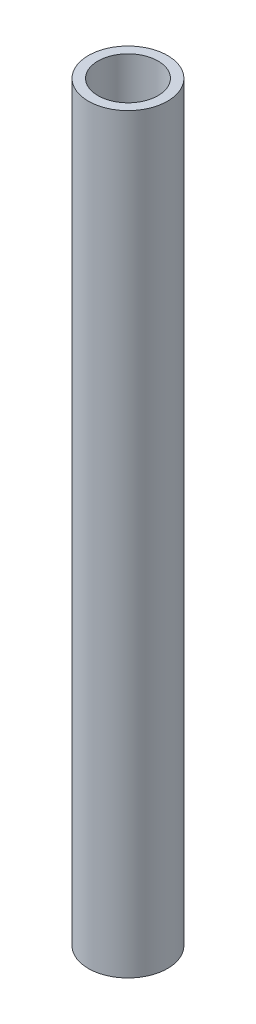
ISO-10303-21;
HEADER;
FILE_DESCRIPTION(('STEP AP214'),'2;1');
FILE_NAME('part.step','',(''),(''),'','','');
FILE_SCHEMA(('AUTOMOTIVE_DESIGN { 1 0 10303 214 1 1 1 1 }'));
ENDSEC;
DATA;
#1=APPLICATION_CONTEXT('core data for automotive mechanical design processes');
#2=APPLICATION_PROTOCOL_DEFINITION('international standard','automotive_design',2000,#1);
#3=PRODUCT_CONTEXT('',#1,'mechanical');
#4=PRODUCT('Part','Part','',(#3));
#5=PRODUCT_RELATED_PRODUCT_CATEGORY('part','',(#4));
#6=PRODUCT_DEFINITION_FORMATION('','',#4);
#7=PRODUCT_DEFINITION_CONTEXT('part definition',#1,'design');
#8=PRODUCT_DEFINITION('design','',#6,#7);
#9=PRODUCT_DEFINITION_SHAPE('','',#8);
#10=(LENGTH_UNIT() NAMED_UNIT(*) SI_UNIT(.MILLI.,.METRE.));
#11=(NAMED_UNIT(*) PLANE_ANGLE_UNIT() SI_UNIT($,.RADIAN.));
#12=(NAMED_UNIT(*) SI_UNIT($,.STERADIAN.) SOLID_ANGLE_UNIT());
#13=UNCERTAINTY_MEASURE_WITH_UNIT(LENGTH_MEASURE(1.E-05),#10,'distance_accuracy_value','');
#14=(GEOMETRIC_REPRESENTATION_CONTEXT(3) GLOBAL_UNCERTAINTY_ASSIGNED_CONTEXT((#13)) GLOBAL_UNIT_ASSIGNED_CONTEXT((#10,
#11,#12)) REPRESENTATION_CONTEXT('',''));
#15=CARTESIAN_POINT('',(0.,0.,0.));
#16=DIRECTION('',(0.,0.,1.));
#17=DIRECTION('',(1.,0.,0.));
#18=AXIS2_PLACEMENT_3D('',#15,#16,#17);
#19=CARTESIAN_POINT('',(0.,20.,0.));
#20=DIRECTION('',(0.,1.,0.));
#21=DIRECTION('',(0.,0.,1.));
#22=AXIS2_PLACEMENT_3D('',#19,#20,#21);
#23=PLANE('',#22);
#24=CARTESIAN_POINT('',(0.,20.,0.));
#25=DIRECTION('',(0.,1.,0.));
#26=DIRECTION('',(0.,0.,1.));
#27=AXIS2_PLACEMENT_3D('',#24,#25,#26);
#28=CIRCLE('',#27,1.054);
#29=CARTESIAN_POINT('',(0.,20.,1.054));
#30=VERTEX_POINT('',#29);
#31=EDGE_CURVE('E10',#30,#30,#28,.T.);
#32=ORIENTED_EDGE('',*,*,#31,.T.);
#33=EDGE_LOOP('',(#32));
#34=FACE_BOUND('',#33,.T.);
#35=CARTESIAN_POINT('',(0.,20.,0.));
#36=DIRECTION('',(0.,1.,0.));
#37=DIRECTION('',(0.,0.,1.));
#38=AXIS2_PLACEMENT_3D('',#35,#36,#37);
#39=CIRCLE('',#38,0.8);
#40=CARTESIAN_POINT('',(0.,20.,0.8));
#41=VERTEX_POINT('',#40);
#42=EDGE_CURVE('E42',#41,#41,#39,.T.);
#43=ORIENTED_EDGE('',*,*,#42,.F.);
#44=EDGE_LOOP('',(#43));
#45=FACE_BOUND('',#44,.T.);
#46=ADVANCED_FACE('F31',(#34,#45),#23,.T.);
#47=CARTESIAN_POINT('',(0.,0.,0.));
#48=DIRECTION('',(0.,1.,0.));
#49=DIRECTION('',(0.,0.,1.));
#50=AXIS2_PLACEMENT_3D('',#47,#48,#49);
#51=PLANE('',#50);
#52=CARTESIAN_POINT('',(0.,0.,0.));
#53=DIRECTION('',(0.,1.,0.));
#54=DIRECTION('',(0.,0.,1.));
#55=AXIS2_PLACEMENT_3D('',#52,#53,#54);
#56=CIRCLE('',#55,1.054);
#57=CARTESIAN_POINT('',(0.,0.,1.054));
#58=VERTEX_POINT('',#57);
#59=EDGE_CURVE('E35',#58,#58,#56,.T.);
#60=ORIENTED_EDGE('',*,*,#59,.F.);
#61=EDGE_LOOP('',(#60));
#62=FACE_BOUND('',#61,.T.);
#63=CARTESIAN_POINT('',(0.,0.,0.));
#64=DIRECTION('',(0.,1.,0.));
#65=DIRECTION('',(0.,0.,1.));
#66=AXIS2_PLACEMENT_3D('',#63,#64,#65);
#67=CIRCLE('',#66,0.8);
#68=CARTESIAN_POINT('',(0.,0.,0.8));
#69=VERTEX_POINT('',#68);
#70=EDGE_CURVE('E44',#69,#69,#67,.T.);
#71=ORIENTED_EDGE('',*,*,#70,.T.);
#72=EDGE_LOOP('',(#71));
#73=FACE_BOUND('',#72,.T.);
#74=ADVANCED_FACE('F54',(#62,#73),#51,.F.);
#75=CARTESIAN_POINT('',(0.,20.,0.));
#76=DIRECTION('',(0.,-1.,0.));
#77=DIRECTION('',(0.,0.,-1.));
#78=AXIS2_PLACEMENT_3D('',#75,#76,#77);
#79=CYLINDRICAL_SURFACE('',#78,1.054);
#80=ORIENTED_EDGE('',*,*,#31,.F.);
#81=EDGE_LOOP('',(#80));
#82=FACE_BOUND('',#81,.T.);
#83=ORIENTED_EDGE('',*,*,#59,.T.);
#84=EDGE_LOOP('',(#83));
#85=FACE_BOUND('',#84,.T.);
#86=ADVANCED_FACE('F33',(#82,#85),#79,.T.);
#87=CARTESIAN_POINT('',(0.,20.,0.));
#88=DIRECTION('',(0.,-1.,0.));
#89=DIRECTION('',(0.,0.,-1.));
#90=AXIS2_PLACEMENT_3D('',#87,#88,#89);
#91=CYLINDRICAL_SURFACE('',#90,0.8);
#92=ORIENTED_EDGE('',*,*,#42,.T.);
#93=EDGE_LOOP('',(#92));
#94=FACE_BOUND('',#93,.T.);
#95=ORIENTED_EDGE('',*,*,#70,.F.);
#96=EDGE_LOOP('',(#95));
#97=FACE_BOUND('',#96,.T.);
#98=ADVANCED_FACE('F50',(#94,#97),#91,.F.);
#99=CLOSED_SHELL('',(#46,#74,#86,#98));
#100=MANIFOLD_SOLID_BREP('B2',#99);
#101=ADVANCED_BREP_SHAPE_REPRESENTATION('',(#18,#100),#14);
#102=SHAPE_DEFINITION_REPRESENTATION(#9,#101);
ENDSEC;
END-ISO-10303-21;
